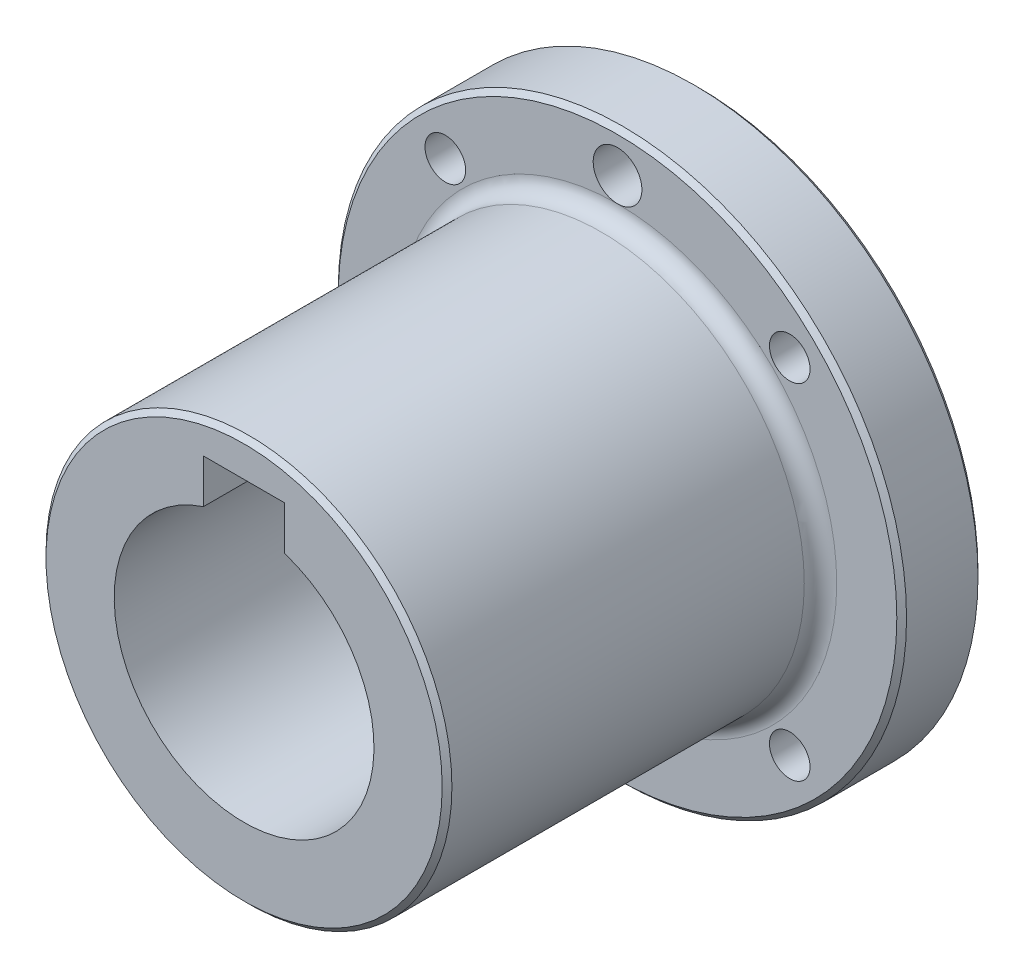
ISO-10303-21;
HEADER;
FILE_DESCRIPTION(('STEP AP214'),'2;1');
FILE_NAME('part.step','',(''),(''),'','','');
FILE_SCHEMA(('AUTOMOTIVE_DESIGN { 1 0 10303 214 1 1 1 1 }'));
ENDSEC;
DATA;
#1=APPLICATION_CONTEXT('core data for automotive mechanical design processes');
#2=APPLICATION_PROTOCOL_DEFINITION('international standard','automotive_design',2000,#1);
#3=PRODUCT_CONTEXT('',#1,'mechanical');
#4=PRODUCT('Part','Part','',(#3));
#5=PRODUCT_RELATED_PRODUCT_CATEGORY('part','',(#4));
#6=PRODUCT_DEFINITION_FORMATION('','',#4);
#7=PRODUCT_DEFINITION_CONTEXT('part definition',#1,'design');
#8=PRODUCT_DEFINITION('design','',#6,#7);
#9=PRODUCT_DEFINITION_SHAPE('','',#8);
#10=(LENGTH_UNIT() NAMED_UNIT(*) SI_UNIT(.MILLI.,.METRE.));
#11=(NAMED_UNIT(*) PLANE_ANGLE_UNIT() SI_UNIT($,.RADIAN.));
#12=(NAMED_UNIT(*) SI_UNIT($,.STERADIAN.) SOLID_ANGLE_UNIT());
#13=UNCERTAINTY_MEASURE_WITH_UNIT(LENGTH_MEASURE(1.E-05),#10,'distance_accuracy_value','');
#14=(GEOMETRIC_REPRESENTATION_CONTEXT(3) GLOBAL_UNCERTAINTY_ASSIGNED_CONTEXT((#13)) GLOBAL_UNIT_ASSIGNED_CONTEXT((#10,
#11,#12)) REPRESENTATION_CONTEXT('',''));
#15=CARTESIAN_POINT('',(0.,0.,0.));
#16=DIRECTION('',(0.,0.,1.));
#17=DIRECTION('',(1.,0.,0.));
#18=AXIS2_PLACEMENT_3D('',#15,#16,#17);
#19=CARTESIAN_POINT('',(100.,0.,5.));
#20=DIRECTION('',(0.,0.,-1.));
#21=DIRECTION('',(-1.,0.,0.));
#22=AXIS2_PLACEMENT_3D('',#19,#20,#21);
#23=CYLINDRICAL_SURFACE('',#22,17.5);
#24=CARTESIAN_POINT('',(100.,0.,0.299999999999995));
#25=DIRECTION('',(0.,0.,1.));
#26=DIRECTION('',(1.,0.,0.));
#27=AXIS2_PLACEMENT_3D('',#24,#25,#26);
#28=CIRCLE('',#27,17.5);
#29=CARTESIAN_POINT('',(117.5,0.,0.299999999999995));
#30=VERTEX_POINT('',#29);
#31=EDGE_CURVE('E181',#30,#30,#28,.T.);
#32=ORIENTED_EDGE('',*,*,#31,.T.);
#33=EDGE_LOOP('',(#32));
#34=FACE_BOUND('',#33,.T.);
#35=CARTESIAN_POINT('',(100.,0.,4.70000000000001));
#36=DIRECTION('',(0.,0.,1.));
#37=DIRECTION('',(1.,0.,0.));
#38=AXIS2_PLACEMENT_3D('',#35,#36,#37);
#39=CIRCLE('',#38,17.5);
#40=CARTESIAN_POINT('',(117.5,0.,4.70000000000001));
#41=VERTEX_POINT('',#40);
#42=EDGE_CURVE('E178',#41,#41,#39,.F.);
#43=ORIENTED_EDGE('',*,*,#42,.T.);
#44=EDGE_LOOP('',(#43));
#45=FACE_BOUND('',#44,.T.);
#46=ADVANCED_FACE('F42',(#34,#45),#23,.T.);
#47=CARTESIAN_POINT('',(100.,0.,5.));
#48=DIRECTION('',(0.,0.,1.));
#49=DIRECTION('',(1.,0.,0.));
#50=AXIS2_PLACEMENT_3D('',#47,#48,#49);
#51=PLANE('',#50);
#52=CARTESIAN_POINT('',(100.,0.,5.));
#53=DIRECTION('',(0.,0.,1.));
#54=DIRECTION('',(1.,0.,0.));
#55=AXIS2_PLACEMENT_3D('',#52,#53,#54);
#56=CIRCLE('',#55,17.2);
#57=CARTESIAN_POINT('',(117.2,0.,5.));
#58=VERTEX_POINT('',#57);
#59=EDGE_CURVE('E184',#58,#58,#56,.T.);
#60=ORIENTED_EDGE('',*,*,#59,.T.);
#61=EDGE_LOOP('',(#60));
#62=FACE_BOUND('',#61,.T.);
#63=CARTESIAN_POINT('',(110.606601717798,10.6066017177983,5.));
#64=DIRECTION('',(0.,0.,-1.));
#65=DIRECTION('',(-1.,0.,0.));
#66=AXIS2_PLACEMENT_3D('',#63,#64,#65);
#67=CIRCLE('',#66,1.25);
#68=CARTESIAN_POINT('',(109.356601717798,10.6066017177983,5.));
#69=VERTEX_POINT('',#68);
#70=EDGE_CURVE('E121',#69,#69,#67,.T.);
#71=ORIENTED_EDGE('',*,*,#70,.T.);
#72=EDGE_LOOP('',(#71));
#73=FACE_BOUND('',#72,.T.);
#74=CARTESIAN_POINT('',(89.3933982822018,10.6066017177983,5.));
#75=DIRECTION('',(0.,0.,-1.));
#76=DIRECTION('',(-1.,0.,0.));
#77=AXIS2_PLACEMENT_3D('',#74,#75,#76);
#78=CIRCLE('',#77,1.25);
#79=CARTESIAN_POINT('',(88.1433982822018,10.6066017177983,5.));
#80=VERTEX_POINT('',#79);
#81=EDGE_CURVE('E127',#80,#80,#78,.T.);
#82=ORIENTED_EDGE('',*,*,#81,.T.);
#83=EDGE_LOOP('',(#82));
#84=FACE_BOUND('',#83,.T.);
#85=CARTESIAN_POINT('',(110.606601717798,-10.6066017177982,5.));
#86=DIRECTION('',(0.,0.,-1.));
#87=DIRECTION('',(-1.,0.,0.));
#88=AXIS2_PLACEMENT_3D('',#85,#86,#87);
#89=CIRCLE('',#88,1.25);
#90=CARTESIAN_POINT('',(109.356601717798,-10.6066017177982,5.));
#91=VERTEX_POINT('',#90);
#92=EDGE_CURVE('E130',#91,#91,#89,.T.);
#93=ORIENTED_EDGE('',*,*,#92,.T.);
#94=EDGE_LOOP('',(#93));
#95=FACE_BOUND('',#94,.T.);
#96=CARTESIAN_POINT('',(89.3933982822018,-10.6066017177982,5.));
#97=DIRECTION('',(0.,0.,-1.));
#98=DIRECTION('',(-1.,0.,0.));
#99=AXIS2_PLACEMENT_3D('',#96,#97,#98);
#100=CIRCLE('',#99,1.25);
#101=CARTESIAN_POINT('',(88.1433982822018,-10.6066017177982,5.));
#102=VERTEX_POINT('',#101);
#103=EDGE_CURVE('E133',#102,#102,#100,.T.);
#104=ORIENTED_EDGE('',*,*,#103,.T.);
#105=EDGE_LOOP('',(#104));
#106=FACE_BOUND('',#105,.T.);
#107=CARTESIAN_POINT('',(100.,15.,5.));
#108=DIRECTION('',(0.,0.,-1.));
#109=DIRECTION('',(-1.,0.,0.));
#110=AXIS2_PLACEMENT_3D('',#107,#108,#109);
#111=CIRCLE('',#110,1.5);
#112=CARTESIAN_POINT('',(100.,13.5,5.));
#113=VERTEX_POINT('',#112);
#114=EDGE_CURVE('E136',#113,#113,#111,.T.);
#115=ORIENTED_EDGE('',*,*,#114,.T.);
#116=CARTESIAN_POINT('',(100.,0.,5.));
#117=DIRECTION('',(0.,0.,1.));
#118=DIRECTION('',(1.,0.,0.));
#119=AXIS2_PLACEMENT_3D('',#116,#117,#118);
#120=CIRCLE('',#119,13.5);
#121=EDGE_CURVE('E11',#113,#113,#120,.F.);
#122=ORIENTED_EDGE('',*,*,#121,.T.);
#123=EDGE_LOOP('',(#115,#122));
#124=FACE_BOUND('',#123,.T.);
#125=ADVANCED_FACE('F199',(#62,#73,#84,#95,#106,#124),#51,.T.);
#126=CARTESIAN_POINT('',(100.,0.,0.));
#127=DIRECTION('',(0.,0.,1.));
#128=DIRECTION('',(1.,0.,0.));
#129=AXIS2_PLACEMENT_3D('',#126,#127,#128);
#130=PLANE('',#129);
#131=DIRECTION('',(0.,-1.,0.));
#132=VECTOR('',#131,1.);
#133=CARTESIAN_POINT('',(102.5,10.3,0.));
#134=LINE('',#133,#132);
#135=CARTESIAN_POINT('',(102.5,10.3,0.));
#136=VERTEX_POINT('',#135);
#137=CARTESIAN_POINT('',(102.5,7.59934207678533,0.));
#138=VERTEX_POINT('',#137);
#139=EDGE_CURVE('E102',#136,#138,#134,.T.);
#140=ORIENTED_EDGE('',*,*,#139,.F.);
#141=DIRECTION('',(-1.,0.,0.));
#142=VECTOR('',#141,1.);
#143=CARTESIAN_POINT('',(102.5,10.3,0.));
#144=LINE('',#143,#142);
#145=CARTESIAN_POINT('',(97.5,10.3,0.));
#146=VERTEX_POINT('',#145);
#147=EDGE_CURVE('E94',#136,#146,#144,.T.);
#148=ORIENTED_EDGE('',*,*,#147,.T.);
#149=DIRECTION('',(0.,1.,0.));
#150=VECTOR('',#149,1.);
#151=CARTESIAN_POINT('',(97.5,7.59934207678533,0.));
#152=LINE('',#151,#150);
#153=CARTESIAN_POINT('',(97.5,7.59934207678533,0.));
#154=VERTEX_POINT('',#153);
#155=EDGE_CURVE('E85',#154,#146,#152,.T.);
#156=ORIENTED_EDGE('',*,*,#155,.F.);
#157=CARTESIAN_POINT('',(100.,0.,0.));
#158=DIRECTION('',(0.,0.,1.));
#159=DIRECTION('',(1.,0.,0.));
#160=AXIS2_PLACEMENT_3D('',#157,#158,#159);
#161=CIRCLE('',#160,8.);
#162=EDGE_CURVE('E61',#154,#138,#161,.T.);
#163=ORIENTED_EDGE('',*,*,#162,.T.);
#164=EDGE_LOOP('',(#140,#148,#156,#163));
#165=FACE_BOUND('',#164,.T.);
#166=CARTESIAN_POINT('',(100.,15.,0.));
#167=DIRECTION('',(0.,0.,1.));
#168=DIRECTION('',(1.,0.,0.));
#169=AXIS2_PLACEMENT_3D('',#166,#167,#168);
#170=CIRCLE('',#169,1.8);
#171=CARTESIAN_POINT('',(101.8,15.,0.));
#172=VERTEX_POINT('',#171);
#173=EDGE_CURVE('E157',#172,#172,#170,.T.);
#174=ORIENTED_EDGE('',*,*,#173,.T.);
#175=EDGE_LOOP('',(#174));
#176=FACE_BOUND('',#175,.T.);
#177=CARTESIAN_POINT('',(89.3933982822018,-10.6066017177982,0.));
#178=DIRECTION('',(0.,0.,1.));
#179=DIRECTION('',(1.,0.,0.));
#180=AXIS2_PLACEMENT_3D('',#177,#178,#179);
#181=CIRCLE('',#180,1.55);
#182=CARTESIAN_POINT('',(90.9433982822018,-10.6066017177982,0.));
#183=VERTEX_POINT('',#182);
#184=EDGE_CURVE('E154',#183,#183,#181,.T.);
#185=ORIENTED_EDGE('',*,*,#184,.T.);
#186=EDGE_LOOP('',(#185));
#187=FACE_BOUND('',#186,.T.);
#188=CARTESIAN_POINT('',(110.606601717798,-10.6066017177982,0.));
#189=DIRECTION('',(0.,0.,1.));
#190=DIRECTION('',(1.,0.,0.));
#191=AXIS2_PLACEMENT_3D('',#188,#189,#190);
#192=CIRCLE('',#191,1.55);
#193=CARTESIAN_POINT('',(112.156601717798,-10.6066017177982,0.));
#194=VERTEX_POINT('',#193);
#195=EDGE_CURVE('E151',#194,#194,#192,.T.);
#196=ORIENTED_EDGE('',*,*,#195,.T.);
#197=EDGE_LOOP('',(#196));
#198=FACE_BOUND('',#197,.T.);
#199=CARTESIAN_POINT('',(89.3933982822018,10.6066017177983,0.));
#200=DIRECTION('',(0.,0.,1.));
#201=DIRECTION('',(1.,0.,0.));
#202=AXIS2_PLACEMENT_3D('',#199,#200,#201);
#203=CIRCLE('',#202,1.55);
#204=CARTESIAN_POINT('',(90.9433982822018,10.6066017177983,0.));
#205=VERTEX_POINT('',#204);
#206=EDGE_CURVE('E148',#205,#205,#203,.T.);
#207=ORIENTED_EDGE('',*,*,#206,.T.);
#208=EDGE_LOOP('',(#207));
#209=FACE_BOUND('',#208,.T.);
#210=CARTESIAN_POINT('',(110.606601717798,10.6066017177983,0.));
#211=DIRECTION('',(0.,0.,1.));
#212=DIRECTION('',(1.,0.,0.));
#213=AXIS2_PLACEMENT_3D('',#210,#211,#212);
#214=CIRCLE('',#213,1.55);
#215=CARTESIAN_POINT('',(112.156601717798,10.6066017177983,0.));
#216=VERTEX_POINT('',#215);
#217=EDGE_CURVE('E145',#216,#216,#214,.T.);
#218=ORIENTED_EDGE('',*,*,#217,.T.);
#219=EDGE_LOOP('',(#218));
#220=FACE_BOUND('',#219,.T.);
#221=CARTESIAN_POINT('',(100.,0.,0.));
#222=DIRECTION('',(0.,0.,1.));
#223=DIRECTION('',(1.,0.,0.));
#224=AXIS2_PLACEMENT_3D('',#221,#222,#223);
#225=CIRCLE('',#224,17.2);
#226=CARTESIAN_POINT('',(117.2,0.,0.));
#227=VERTEX_POINT('',#226);
#228=EDGE_CURVE('E142',#227,#227,#225,.F.);
#229=ORIENTED_EDGE('',*,*,#228,.T.);
#230=EDGE_LOOP('',(#229));
#231=FACE_BOUND('',#230,.T.);
#232=ADVANCED_FACE('F104',(#165,#176,#187,#198,#209,#220,#231),#130,.F.);
#233=CARTESIAN_POINT('',(100.,15.,0.));
#234=DIRECTION('',(0.,0.,-1.));
#235=DIRECTION('',(-1.,0.,0.));
#236=AXIS2_PLACEMENT_3D('',#233,#234,#235);
#237=CYLINDRICAL_SURFACE('',#236,1.5);
#238=CARTESIAN_POINT('',(100.,15.,0.299999999999986));
#239=DIRECTION('',(0.,0.,1.));
#240=DIRECTION('',(1.,0.,0.));
#241=AXIS2_PLACEMENT_3D('',#238,#239,#240);
#242=CIRCLE('',#241,1.5);
#243=CARTESIAN_POINT('',(101.5,15.,0.299999999999986));
#244=VERTEX_POINT('',#243);
#245=EDGE_CURVE('E139',#244,#244,#242,.F.);
#246=ORIENTED_EDGE('',*,*,#245,.T.);
#247=EDGE_LOOP('',(#246));
#248=FACE_BOUND('',#247,.T.);
#249=ORIENTED_EDGE('',*,*,#114,.F.);
#250=EDGE_LOOP('',(#249));
#251=FACE_BOUND('',#250,.T.);
#252=ADVANCED_FACE('F273',(#248,#251),#237,.F.);
#253=CARTESIAN_POINT('',(89.3933982822018,-10.6066017177982,0.));
#254=DIRECTION('',(0.,0.,-1.));
#255=DIRECTION('',(-1.,0.,0.));
#256=AXIS2_PLACEMENT_3D('',#253,#254,#255);
#257=CYLINDRICAL_SURFACE('',#256,1.25);
#258=CARTESIAN_POINT('',(89.3933982822018,-10.6066017177982,0.299999999999992));
#259=DIRECTION('',(0.,0.,1.));
#260=DIRECTION('',(1.,0.,0.));
#261=AXIS2_PLACEMENT_3D('',#258,#259,#260);
#262=CIRCLE('',#261,1.25);
#263=CARTESIAN_POINT('',(90.6433982822018,-10.6066017177982,0.299999999999992));
#264=VERTEX_POINT('',#263);
#265=EDGE_CURVE('E160',#264,#264,#262,.F.);
#266=ORIENTED_EDGE('',*,*,#265,.T.);
#267=EDGE_LOOP('',(#266));
#268=FACE_BOUND('',#267,.T.);
#269=ORIENTED_EDGE('',*,*,#103,.F.);
#270=EDGE_LOOP('',(#269));
#271=FACE_BOUND('',#270,.T.);
#272=ADVANCED_FACE('F275',(#268,#271),#257,.F.);
#273=CARTESIAN_POINT('',(110.606601717798,-10.6066017177982,0.));
#274=DIRECTION('',(0.,0.,-1.));
#275=DIRECTION('',(-1.,0.,0.));
#276=AXIS2_PLACEMENT_3D('',#273,#274,#275);
#277=CYLINDRICAL_SURFACE('',#276,1.25);
#278=CARTESIAN_POINT('',(110.606601717798,-10.6066017177982,0.299999999999992));
#279=DIRECTION('',(0.,0.,1.));
#280=DIRECTION('',(1.,0.,0.));
#281=AXIS2_PLACEMENT_3D('',#278,#279,#280);
#282=CIRCLE('',#281,1.25);
#283=CARTESIAN_POINT('',(111.856601717798,-10.6066017177982,0.299999999999992));
#284=VERTEX_POINT('',#283);
#285=EDGE_CURVE('E163',#284,#284,#282,.F.);
#286=ORIENTED_EDGE('',*,*,#285,.T.);
#287=EDGE_LOOP('',(#286));
#288=FACE_BOUND('',#287,.T.);
#289=ORIENTED_EDGE('',*,*,#92,.F.);
#290=EDGE_LOOP('',(#289));
#291=FACE_BOUND('',#290,.T.);
#292=ADVANCED_FACE('F282',(#288,#291),#277,.F.);
#293=CARTESIAN_POINT('',(89.3933982822018,10.6066017177983,0.));
#294=DIRECTION('',(0.,0.,-1.));
#295=DIRECTION('',(-1.,0.,0.));
#296=AXIS2_PLACEMENT_3D('',#293,#294,#295);
#297=CYLINDRICAL_SURFACE('',#296,1.25);
#298=CARTESIAN_POINT('',(89.3933982822018,10.6066017177983,0.300000000000006));
#299=DIRECTION('',(0.,0.,1.));
#300=DIRECTION('',(1.,0.,0.));
#301=AXIS2_PLACEMENT_3D('',#298,#299,#300);
#302=CIRCLE('',#301,1.25);
#303=CARTESIAN_POINT('',(90.6433982822018,10.6066017177983,0.300000000000006));
#304=VERTEX_POINT('',#303);
#305=EDGE_CURVE('E166',#304,#304,#302,.F.);
#306=ORIENTED_EDGE('',*,*,#305,.T.);
#307=EDGE_LOOP('',(#306));
#308=FACE_BOUND('',#307,.T.);
#309=ORIENTED_EDGE('',*,*,#81,.F.);
#310=EDGE_LOOP('',(#309));
#311=FACE_BOUND('',#310,.T.);
#312=ADVANCED_FACE('F292',(#308,#311),#297,.F.);
#313=CARTESIAN_POINT('',(110.606601717798,10.6066017177983,0.));
#314=DIRECTION('',(0.,0.,-1.));
#315=DIRECTION('',(-1.,0.,0.));
#316=AXIS2_PLACEMENT_3D('',#313,#314,#315);
#317=CYLINDRICAL_SURFACE('',#316,1.25);
#318=CARTESIAN_POINT('',(110.606601717798,10.6066017177983,0.299999999999992));
#319=DIRECTION('',(0.,0.,1.));
#320=DIRECTION('',(1.,0.,0.));
#321=AXIS2_PLACEMENT_3D('',#318,#319,#320);
#322=CIRCLE('',#321,1.25);
#323=CARTESIAN_POINT('',(111.856601717798,10.6066017177983,0.299999999999992));
#324=VERTEX_POINT('',#323);
#325=EDGE_CURVE('E169',#324,#324,#322,.F.);
#326=ORIENTED_EDGE('',*,*,#325,.T.);
#327=EDGE_LOOP('',(#326));
#328=FACE_BOUND('',#327,.T.);
#329=ORIENTED_EDGE('',*,*,#70,.F.);
#330=EDGE_LOOP('',(#329));
#331=FACE_BOUND('',#330,.T.);
#332=ADVANCED_FACE('F297',(#328,#331),#317,.F.);
#333=CARTESIAN_POINT('',(100.,0.,28.));
#334=DIRECTION('',(0.,0.,-1.));
#335=DIRECTION('',(-1.,0.,0.));
#336=AXIS2_PLACEMENT_3D('',#333,#334,#335);
#337=CYLINDRICAL_SURFACE('',#336,12.5);
#338=CARTESIAN_POINT('',(100.,0.,6.));
#339=DIRECTION('',(0.,0.,1.));
#340=DIRECTION('',(1.,0.,0.));
#341=AXIS2_PLACEMENT_3D('',#338,#339,#340);
#342=CIRCLE('',#341,12.5);
#343=CARTESIAN_POINT('',(112.5,0.,6.));
#344=VERTEX_POINT('',#343);
#345=EDGE_CURVE('E51',#344,#344,#342,.T.);
#346=ORIENTED_EDGE('',*,*,#345,.T.);
#347=EDGE_LOOP('',(#346));
#348=FACE_BOUND('',#347,.T.);
#349=CARTESIAN_POINT('',(100.,0.,27.7));
#350=DIRECTION('',(0.,0.,1.));
#351=DIRECTION('',(1.,0.,0.));
#352=AXIS2_PLACEMENT_3D('',#349,#350,#351);
#353=CIRCLE('',#352,12.5);
#354=CARTESIAN_POINT('',(112.5,0.,27.7));
#355=VERTEX_POINT('',#354);
#356=EDGE_CURVE('E175',#355,#355,#353,.F.);
#357=ORIENTED_EDGE('',*,*,#356,.T.);
#358=EDGE_LOOP('',(#357));
#359=FACE_BOUND('',#358,.T.);
#360=ADVANCED_FACE('F189',(#348,#359),#337,.T.);
#361=CARTESIAN_POINT('',(100.,0.,28.));
#362=DIRECTION('',(0.,0.,1.));
#363=DIRECTION('',(1.,0.,0.));
#364=AXIS2_PLACEMENT_3D('',#361,#362,#363);
#365=PLANE('',#364);
#366=DIRECTION('',(-1.,0.,0.));
#367=VECTOR('',#366,1.);
#368=CARTESIAN_POINT('',(102.5,10.3,28.));
#369=LINE('',#368,#367);
#370=CARTESIAN_POINT('',(102.5,10.3,28.));
#371=VERTEX_POINT('',#370);
#372=CARTESIAN_POINT('',(97.5,10.3,28.));
#373=VERTEX_POINT('',#372);
#374=EDGE_CURVE('E101',#371,#373,#369,.T.);
#375=ORIENTED_EDGE('',*,*,#374,.F.);
#376=DIRECTION('',(0.,-1.,0.));
#377=VECTOR('',#376,1.);
#378=CARTESIAN_POINT('',(102.5,10.3,28.));
#379=LINE('',#378,#377);
#380=CARTESIAN_POINT('',(102.5,7.59934207678533,28.));
#381=VERTEX_POINT('',#380);
#382=EDGE_CURVE('E106',#371,#381,#379,.T.);
#383=ORIENTED_EDGE('',*,*,#382,.T.);
#384=CARTESIAN_POINT('',(100.,0.,28.));
#385=DIRECTION('',(0.,0.,1.));
#386=DIRECTION('',(1.,0.,0.));
#387=AXIS2_PLACEMENT_3D('',#384,#385,#386);
#388=CIRCLE('',#387,8.);
#389=CARTESIAN_POINT('',(97.5,7.59934207678533,28.));
#390=VERTEX_POINT('',#389);
#391=EDGE_CURVE('E109',#390,#381,#388,.T.);
#392=ORIENTED_EDGE('',*,*,#391,.F.);
#393=DIRECTION('',(0.,1.,0.));
#394=VECTOR('',#393,1.);
#395=CARTESIAN_POINT('',(97.5,7.59934207678533,28.));
#396=LINE('',#395,#394);
#397=EDGE_CURVE('E115',#390,#373,#396,.T.);
#398=ORIENTED_EDGE('',*,*,#397,.T.);
#399=EDGE_LOOP('',(#375,#383,#392,#398));
#400=FACE_BOUND('',#399,.T.);
#401=CARTESIAN_POINT('',(100.,0.,28.));
#402=DIRECTION('',(0.,0.,1.));
#403=DIRECTION('',(1.,0.,0.));
#404=AXIS2_PLACEMENT_3D('',#401,#402,#403);
#405=CIRCLE('',#404,12.2);
#406=CARTESIAN_POINT('',(112.2,0.,28.));
#407=VERTEX_POINT('',#406);
#408=EDGE_CURVE('E172',#407,#407,#405,.T.);
#409=ORIENTED_EDGE('',*,*,#408,.T.);
#410=EDGE_LOOP('',(#409));
#411=FACE_BOUND('',#410,.T.);
#412=ADVANCED_FACE('F220',(#400,#411),#365,.T.);
#413=CARTESIAN_POINT('',(100.,15.,0.299999999999986));
#414=DIRECTION('',(0.,0.,-1.));
#415=DIRECTION('',(-1.,0.,0.));
#416=AXIS2_PLACEMENT_3D('',#413,#414,#415);
#417=CONICAL_SURFACE('',#416,1.5,0.785398163397463);
#418=ORIENTED_EDGE('',*,*,#173,.F.);
#419=EDGE_LOOP('',(#418));
#420=FACE_BOUND('',#419,.T.);
#421=ORIENTED_EDGE('',*,*,#245,.F.);
#422=EDGE_LOOP('',(#421));
#423=FACE_BOUND('',#422,.T.);
#424=ADVANCED_FACE('F214',(#420,#423),#417,.F.);
#425=CARTESIAN_POINT('',(89.3933982822018,-10.6066017177982,0.299999999999992));
#426=DIRECTION('',(0.,0.,-1.));
#427=DIRECTION('',(-1.,0.,0.));
#428=AXIS2_PLACEMENT_3D('',#425,#426,#427);
#429=CONICAL_SURFACE('',#428,1.25,0.785398163397453);
#430=ORIENTED_EDGE('',*,*,#184,.F.);
#431=EDGE_LOOP('',(#430));
#432=FACE_BOUND('',#431,.T.);
#433=ORIENTED_EDGE('',*,*,#265,.F.);
#434=EDGE_LOOP('',(#433));
#435=FACE_BOUND('',#434,.T.);
#436=ADVANCED_FACE('F219',(#432,#435),#429,.F.);
#437=CARTESIAN_POINT('',(110.606601717798,-10.6066017177982,0.299999999999992));
#438=DIRECTION('',(0.,0.,-1.));
#439=DIRECTION('',(-1.,0.,0.));
#440=AXIS2_PLACEMENT_3D('',#437,#438,#439);
#441=CONICAL_SURFACE('',#440,1.25,0.785398163397453);
#442=ORIENTED_EDGE('',*,*,#195,.F.);
#443=EDGE_LOOP('',(#442));
#444=FACE_BOUND('',#443,.T.);
#445=ORIENTED_EDGE('',*,*,#285,.F.);
#446=EDGE_LOOP('',(#445));
#447=FACE_BOUND('',#446,.T.);
#448=ADVANCED_FACE('F225',(#444,#447),#441,.F.);
#449=CARTESIAN_POINT('',(89.3933982822018,10.6066017177983,0.300000000000006));
#450=DIRECTION('',(0.,0.,-1.));
#451=DIRECTION('',(-1.,0.,0.));
#452=AXIS2_PLACEMENT_3D('',#449,#450,#451);
#453=CONICAL_SURFACE('',#452,1.25,0.78539816339743);
#454=ORIENTED_EDGE('',*,*,#206,.F.);
#455=EDGE_LOOP('',(#454));
#456=FACE_BOUND('',#455,.T.);
#457=ORIENTED_EDGE('',*,*,#305,.F.);
#458=EDGE_LOOP('',(#457));
#459=FACE_BOUND('',#458,.T.);
#460=ADVANCED_FACE('F230',(#456,#459),#453,.F.);
#461=CARTESIAN_POINT('',(110.606601717798,10.6066017177983,0.299999999999992));
#462=DIRECTION('',(0.,0.,-1.));
#463=DIRECTION('',(-1.,0.,0.));
#464=AXIS2_PLACEMENT_3D('',#461,#462,#463);
#465=CONICAL_SURFACE('',#464,1.25,0.785398163397453);
#466=ORIENTED_EDGE('',*,*,#217,.F.);
#467=EDGE_LOOP('',(#466));
#468=FACE_BOUND('',#467,.T.);
#469=ORIENTED_EDGE('',*,*,#325,.F.);
#470=EDGE_LOOP('',(#469));
#471=FACE_BOUND('',#470,.T.);
#472=ADVANCED_FACE('F235',(#468,#471),#465,.F.);
#473=CARTESIAN_POINT('',(100.,0.,28.));
#474=DIRECTION('',(0.,0.,-1.));
#475=DIRECTION('',(-1.,0.,0.));
#476=AXIS2_PLACEMENT_3D('',#473,#474,#475);
#477=CONICAL_SURFACE('',#476,12.2,0.785398163397468);
#478=ORIENTED_EDGE('',*,*,#356,.F.);
#479=EDGE_LOOP('',(#478));
#480=FACE_BOUND('',#479,.T.);
#481=ORIENTED_EDGE('',*,*,#408,.F.);
#482=EDGE_LOOP('',(#481));
#483=FACE_BOUND('',#482,.T.);
#484=ADVANCED_FACE('F240',(#480,#483),#477,.T.);
#485=CARTESIAN_POINT('',(100.,0.,0.299999999999995));
#486=DIRECTION('',(0.,0.,1.));
#487=DIRECTION('',(1.,0.,0.));
#488=AXIS2_PLACEMENT_3D('',#485,#486,#487);
#489=CONICAL_SURFACE('',#488,17.5,0.785398163397437);
#490=ORIENTED_EDGE('',*,*,#228,.F.);
#491=EDGE_LOOP('',(#490));
#492=FACE_BOUND('',#491,.T.);
#493=ORIENTED_EDGE('',*,*,#31,.F.);
#494=EDGE_LOOP('',(#493));
#495=FACE_BOUND('',#494,.T.);
#496=ADVANCED_FACE('F245',(#492,#495),#489,.T.);
#497=CARTESIAN_POINT('',(100.,0.,5.));
#498=DIRECTION('',(0.,0.,-1.));
#499=DIRECTION('',(-1.,0.,0.));
#500=AXIS2_PLACEMENT_3D('',#497,#498,#499);
#501=CONICAL_SURFACE('',#500,17.2,0.785398163397443);
#502=ORIENTED_EDGE('',*,*,#42,.F.);
#503=EDGE_LOOP('',(#502));
#504=FACE_BOUND('',#503,.T.);
#505=ORIENTED_EDGE('',*,*,#59,.F.);
#506=EDGE_LOOP('',(#505));
#507=FACE_BOUND('',#506,.T.);
#508=ADVANCED_FACE('F249',(#504,#507),#501,.T.);
#509=CARTESIAN_POINT('',(102.5,10.3,0.));
#510=DIRECTION('',(0.,1.,0.));
#511=DIRECTION('',(-1.,0.,0.));
#512=AXIS2_PLACEMENT_3D('',#509,#510,#511);
#513=PLANE('',#512);
#514=ORIENTED_EDGE('',*,*,#374,.T.);
#515=DIRECTION('',(0.,0.,1.));
#516=VECTOR('',#515,1.);
#517=CARTESIAN_POINT('',(97.5,10.3,0.));
#518=LINE('',#517,#516);
#519=EDGE_CURVE('E89',#146,#373,#518,.T.);
#520=ORIENTED_EDGE('',*,*,#519,.F.);
#521=ORIENTED_EDGE('',*,*,#147,.F.);
#522=DIRECTION('',(0.,0.,1.));
#523=VECTOR('',#522,1.);
#524=CARTESIAN_POINT('',(102.5,10.3,0.));
#525=LINE('',#524,#523);
#526=EDGE_CURVE('E119',#136,#371,#525,.T.);
#527=ORIENTED_EDGE('',*,*,#526,.T.);
#528=EDGE_LOOP('',(#514,#520,#521,#527));
#529=FACE_BOUND('',#528,.T.);
#530=ADVANCED_FACE('F98',(#529),#513,.F.);
#531=CARTESIAN_POINT('',(102.5,10.3,0.));
#532=DIRECTION('',(-1.,0.,0.));
#533=DIRECTION('',(0.,0.,1.));
#534=AXIS2_PLACEMENT_3D('',#531,#532,#533);
#535=PLANE('',#534);
#536=ORIENTED_EDGE('',*,*,#382,.F.);
#537=ORIENTED_EDGE('',*,*,#526,.F.);
#538=ORIENTED_EDGE('',*,*,#139,.T.);
#539=DIRECTION('',(0.,0.,1.));
#540=VECTOR('',#539,1.);
#541=CARTESIAN_POINT('',(102.5,7.59934207678533,0.));
#542=LINE('',#541,#540);
#543=EDGE_CURVE('E122',#138,#381,#542,.T.);
#544=ORIENTED_EDGE('',*,*,#543,.T.);
#545=EDGE_LOOP('',(#536,#537,#538,#544));
#546=FACE_BOUND('',#545,.T.);
#547=ADVANCED_FACE('F257',(#546),#535,.T.);
#548=CARTESIAN_POINT('',(100.,0.,0.));
#549=DIRECTION('',(0.,0.,1.));
#550=DIRECTION('',(1.,0.,0.));
#551=AXIS2_PLACEMENT_3D('',#548,#549,#550);
#552=CYLINDRICAL_SURFACE('',#551,8.);
#553=ORIENTED_EDGE('',*,*,#391,.T.);
#554=ORIENTED_EDGE('',*,*,#543,.F.);
#555=ORIENTED_EDGE('',*,*,#162,.F.);
#556=DIRECTION('',(0.,0.,1.));
#557=VECTOR('',#556,1.);
#558=CARTESIAN_POINT('',(97.5,7.59934207678533,0.));
#559=LINE('',#558,#557);
#560=EDGE_CURVE('E91',#154,#390,#559,.T.);
#561=ORIENTED_EDGE('',*,*,#560,.T.);
#562=EDGE_LOOP('',(#553,#554,#555,#561));
#563=FACE_BOUND('',#562,.T.);
#564=ADVANCED_FACE('F196',(#563),#552,.F.);
#565=CARTESIAN_POINT('',(97.5,7.59934207678533,0.));
#566=DIRECTION('',(1.,0.,0.));
#567=DIRECTION('',(0.,1.,0.));
#568=AXIS2_PLACEMENT_3D('',#565,#566,#567);
#569=PLANE('',#568);
#570=ORIENTED_EDGE('',*,*,#397,.F.);
#571=ORIENTED_EDGE('',*,*,#560,.F.);
#572=ORIENTED_EDGE('',*,*,#155,.T.);
#573=ORIENTED_EDGE('',*,*,#519,.T.);
#574=EDGE_LOOP('',(#570,#571,#572,#573));
#575=FACE_BOUND('',#574,.T.);
#576=ADVANCED_FACE('F88',(#575),#569,.T.);
#577=CARTESIAN_POINT('',(100.,0.,6.));
#578=DIRECTION('',(0.,0.,1.));
#579=DIRECTION('',(1.,0.,0.));
#580=AXIS2_PLACEMENT_3D('',#577,#578,#579);
#581=TOROIDAL_SURFACE('',#580,13.5,1.);
#582=ORIENTED_EDGE('',*,*,#121,.F.);
#583=EDGE_LOOP('',(#582));
#584=FACE_BOUND('',#583,.T.);
#585=ORIENTED_EDGE('',*,*,#345,.F.);
#586=EDGE_LOOP('',(#585));
#587=FACE_BOUND('',#586,.T.);
#588=ADVANCED_FACE('F45',(#584,#587),#581,.F.);
#589=CLOSED_SHELL('',(#46,#125,#232,#252,#272,#292,#312,#332,#360,#412,#424,#436,#448,#460,#472,
#484,#496,#508,#530,#547,#564,#576,#588));
#590=MANIFOLD_SOLID_BREP('B2',#589);
#591=ADVANCED_BREP_SHAPE_REPRESENTATION('',(#18,#590),#14);
#592=SHAPE_DEFINITION_REPRESENTATION(#9,#591);
ENDSEC;
END-ISO-10303-21;
